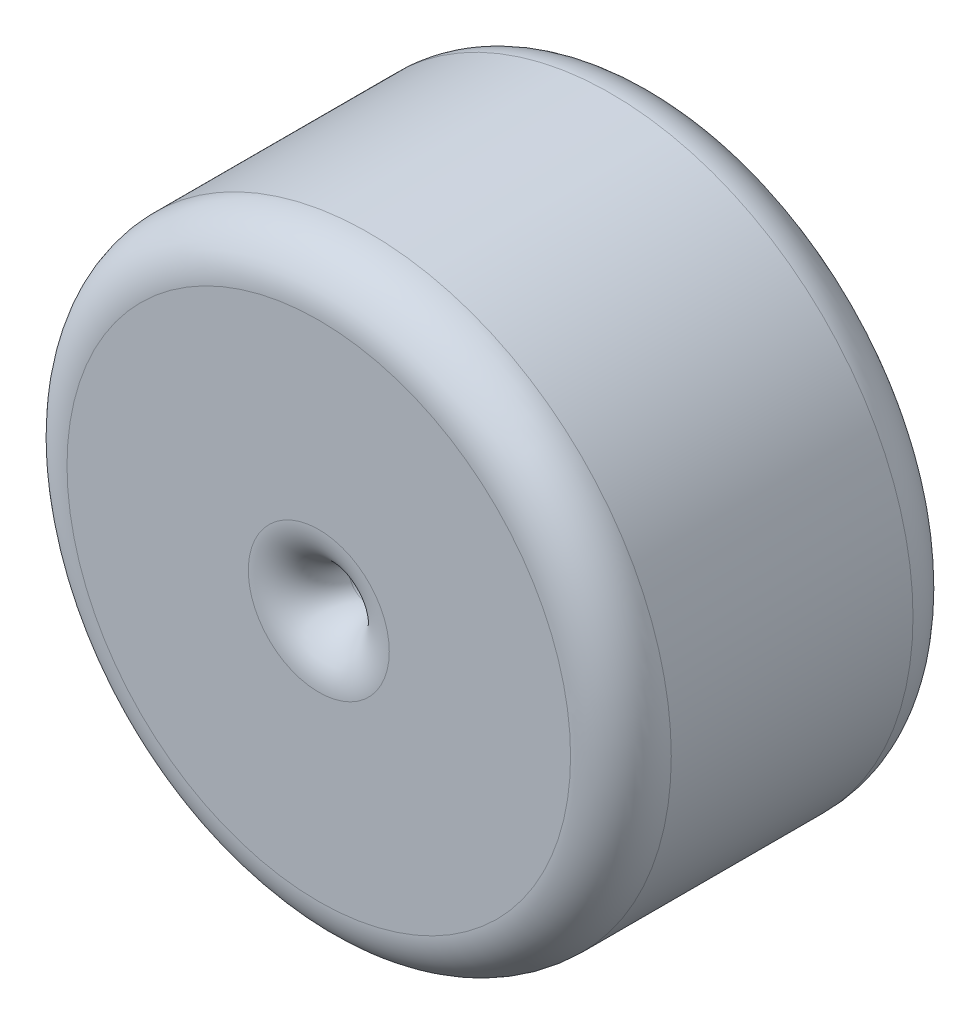
ISO-10303-21;
HEADER;
FILE_DESCRIPTION(('STEP AP214'),'2;1');
FILE_NAME('part.step','',(''),(''),'','','');
FILE_SCHEMA(('AUTOMOTIVE_DESIGN { 1 0 10303 214 1 1 1 1 }'));
ENDSEC;
DATA;
#1=APPLICATION_CONTEXT('core data for automotive mechanical design processes');
#2=APPLICATION_PROTOCOL_DEFINITION('international standard','automotive_design',2000,#1);
#3=PRODUCT_CONTEXT('',#1,'mechanical');
#4=PRODUCT('Part','Part','',(#3));
#5=PRODUCT_RELATED_PRODUCT_CATEGORY('part','',(#4));
#6=PRODUCT_DEFINITION_FORMATION('','',#4);
#7=PRODUCT_DEFINITION_CONTEXT('part definition',#1,'design');
#8=PRODUCT_DEFINITION('design','',#6,#7);
#9=PRODUCT_DEFINITION_SHAPE('','',#8);
#10=(LENGTH_UNIT() NAMED_UNIT(*) SI_UNIT(.MILLI.,.METRE.));
#11=(NAMED_UNIT(*) PLANE_ANGLE_UNIT() SI_UNIT($,.RADIAN.));
#12=(NAMED_UNIT(*) SI_UNIT($,.STERADIAN.) SOLID_ANGLE_UNIT());
#13=UNCERTAINTY_MEASURE_WITH_UNIT(LENGTH_MEASURE(1.E-05),#10,'distance_accuracy_value','');
#14=(GEOMETRIC_REPRESENTATION_CONTEXT(3) GLOBAL_UNCERTAINTY_ASSIGNED_CONTEXT((#13)) GLOBAL_UNIT_ASSIGNED_CONTEXT((#10,
#11,#12)) REPRESENTATION_CONTEXT('',''));
#15=CARTESIAN_POINT('',(0.,0.,0.));
#16=DIRECTION('',(0.,0.,1.));
#17=DIRECTION('',(1.,0.,0.));
#18=AXIS2_PLACEMENT_3D('',#15,#16,#17);
#19=CARTESIAN_POINT('',(0.,0.,17.));
#20=DIRECTION('',(0.,0.,-1.));
#21=DIRECTION('',(-1.,0.,0.));
#22=AXIS2_PLACEMENT_3D('',#19,#20,#21);
#23=CYLINDRICAL_SURFACE('',#22,15.);
#24=CARTESIAN_POINT('',(0.,0.,2.5));
#25=DIRECTION('',(0.,0.,1.));
#26=DIRECTION('',(1.,0.,0.));
#27=AXIS2_PLACEMENT_3D('',#24,#25,#26);
#28=CIRCLE('',#27,15.);
#29=CARTESIAN_POINT('',(15.,0.,2.5));
#30=VERTEX_POINT('',#29);
#31=EDGE_CURVE('E46',#30,#30,#28,.T.);
#32=ORIENTED_EDGE('',*,*,#31,.T.);
#33=EDGE_LOOP('',(#32));
#34=FACE_BOUND('',#33,.T.);
#35=CARTESIAN_POINT('',(0.,0.,14.5));
#36=DIRECTION('',(0.,0.,1.));
#37=DIRECTION('',(1.,0.,0.));
#38=AXIS2_PLACEMENT_3D('',#35,#36,#37);
#39=CIRCLE('',#38,15.);
#40=CARTESIAN_POINT('',(15.,0.,14.5));
#41=VERTEX_POINT('',#40);
#42=EDGE_CURVE('E50',#41,#41,#39,.F.);
#43=ORIENTED_EDGE('',*,*,#42,.T.);
#44=EDGE_LOOP('',(#43));
#45=FACE_BOUND('',#44,.T.);
#46=ADVANCED_FACE('F39',(#34,#45),#23,.T.);
#47=CARTESIAN_POINT('',(0.,0.,17.));
#48=DIRECTION('',(0.,0.,1.));
#49=DIRECTION('',(1.,0.,0.));
#50=AXIS2_PLACEMENT_3D('',#47,#48,#49);
#51=PLANE('',#50);
#52=CARTESIAN_POINT('',(0.,0.,17.));
#53=DIRECTION('',(0.,0.,1.));
#54=DIRECTION('',(1.,0.,0.));
#55=AXIS2_PLACEMENT_3D('',#52,#53,#54);
#56=CIRCLE('',#55,3.5);
#57=CARTESIAN_POINT('',(3.5,0.,17.));
#58=VERTEX_POINT('',#57);
#59=EDGE_CURVE('E59',#58,#58,#56,.F.);
#60=ORIENTED_EDGE('',*,*,#59,.T.);
#61=EDGE_LOOP('',(#60));
#62=FACE_BOUND('',#61,.T.);
#63=CARTESIAN_POINT('',(0.,0.,17.));
#64=DIRECTION('',(0.,0.,1.));
#65=DIRECTION('',(1.,0.,0.));
#66=AXIS2_PLACEMENT_3D('',#63,#64,#65);
#67=CIRCLE('',#66,12.5);
#68=CARTESIAN_POINT('',(12.5,0.,17.));
#69=VERTEX_POINT('',#68);
#70=EDGE_CURVE('E62',#69,#69,#67,.T.);
#71=ORIENTED_EDGE('',*,*,#70,.T.);
#72=EDGE_LOOP('',(#71));
#73=FACE_BOUND('',#72,.T.);
#74=ADVANCED_FACE('F73',(#62,#73),#51,.T.);
#75=CARTESIAN_POINT('',(0.,0.,0.));
#76=DIRECTION('',(0.,0.,1.));
#77=DIRECTION('',(1.,0.,0.));
#78=AXIS2_PLACEMENT_3D('',#75,#76,#77);
#79=PLANE('',#78);
#80=CARTESIAN_POINT('',(0.,0.,0.));
#81=DIRECTION('',(0.,0.,1.));
#82=DIRECTION('',(1.,0.,0.));
#83=AXIS2_PLACEMENT_3D('',#80,#81,#82);
#84=CIRCLE('',#83,12.5);
#85=CARTESIAN_POINT('',(12.5,0.,0.));
#86=VERTEX_POINT('',#85);
#87=EDGE_CURVE('E10',#86,#86,#84,.F.);
#88=ORIENTED_EDGE('',*,*,#87,.T.);
#89=EDGE_LOOP('',(#88));
#90=FACE_BOUND('',#89,.T.);
#91=CARTESIAN_POINT('',(0.,0.,0.));
#92=DIRECTION('',(0.,0.,-1.));
#93=DIRECTION('',(-1.,0.,0.));
#94=AXIS2_PLACEMENT_3D('',#91,#92,#93);
#95=CIRCLE('',#94,1.);
#96=CARTESIAN_POINT('',(-1.,0.,0.));
#97=VERTEX_POINT('',#96);
#98=EDGE_CURVE('E65',#97,#97,#95,.T.);
#99=ORIENTED_EDGE('',*,*,#98,.F.);
#100=EDGE_LOOP('',(#99));
#101=FACE_BOUND('',#100,.T.);
#102=ADVANCED_FACE('F71',(#90,#101),#79,.F.);
#103=CARTESIAN_POINT('',(0.,0.,17.));
#104=DIRECTION('',(0.,0.,-1.));
#105=DIRECTION('',(-1.,0.,0.));
#106=AXIS2_PLACEMENT_3D('',#103,#104,#105);
#107=CYLINDRICAL_SURFACE('',#106,1.);
#108=CARTESIAN_POINT('',(0.,0.,14.5));
#109=DIRECTION('',(0.,0.,1.));
#110=DIRECTION('',(1.,0.,0.));
#111=AXIS2_PLACEMENT_3D('',#108,#109,#110);
#112=CIRCLE('',#111,1.);
#113=CARTESIAN_POINT('',(1.,0.,14.5));
#114=VERTEX_POINT('',#113);
#115=EDGE_CURVE('E54',#114,#114,#112,.T.);
#116=ORIENTED_EDGE('',*,*,#115,.T.);
#117=EDGE_LOOP('',(#116));
#118=FACE_BOUND('',#117,.T.);
#119=ORIENTED_EDGE('',*,*,#98,.T.);
#120=EDGE_LOOP('',(#119));
#121=FACE_BOUND('',#120,.T.);
#122=ADVANCED_FACE('F69',(#118,#121),#107,.F.);
#123=CARTESIAN_POINT('',(0.,0.,14.5));
#124=DIRECTION('',(0.,0.,1.));
#125=DIRECTION('',(1.,0.,0.));
#126=AXIS2_PLACEMENT_3D('',#123,#124,#125);
#127=TOROIDAL_SURFACE('',#126,3.5,2.5);
#128=ORIENTED_EDGE('',*,*,#115,.F.);
#129=EDGE_LOOP('',(#128));
#130=FACE_BOUND('',#129,.T.);
#131=ORIENTED_EDGE('',*,*,#59,.F.);
#132=EDGE_LOOP('',(#131));
#133=FACE_BOUND('',#132,.T.);
#134=ADVANCED_FACE('F79',(#130,#133),#127,.T.);
#135=CARTESIAN_POINT('',(0.,0.,2.5));
#136=DIRECTION('',(0.,0.,1.));
#137=DIRECTION('',(1.,0.,0.));
#138=AXIS2_PLACEMENT_3D('',#135,#136,#137);
#139=TOROIDAL_SURFACE('',#138,12.5,2.5);
#140=ORIENTED_EDGE('',*,*,#87,.F.);
#141=EDGE_LOOP('',(#140));
#142=FACE_BOUND('',#141,.T.);
#143=ORIENTED_EDGE('',*,*,#31,.F.);
#144=EDGE_LOOP('',(#143));
#145=FACE_BOUND('',#144,.T.);
#146=ADVANCED_FACE('F91',(#142,#145),#139,.T.);
#147=CARTESIAN_POINT('',(0.,0.,14.5));
#148=DIRECTION('',(0.,0.,1.));
#149=DIRECTION('',(1.,0.,0.));
#150=AXIS2_PLACEMENT_3D('',#147,#148,#149);
#151=TOROIDAL_SURFACE('',#150,12.5,2.5);
#152=ORIENTED_EDGE('',*,*,#42,.F.);
#153=EDGE_LOOP('',(#152));
#154=FACE_BOUND('',#153,.T.);
#155=ORIENTED_EDGE('',*,*,#70,.F.);
#156=EDGE_LOOP('',(#155));
#157=FACE_BOUND('',#156,.T.);
#158=ADVANCED_FACE('F41',(#154,#157),#151,.T.);
#159=CLOSED_SHELL('',(#46,#74,#102,#122,#134,#146,#158));
#160=MANIFOLD_SOLID_BREP('B2',#159);
#161=ADVANCED_BREP_SHAPE_REPRESENTATION('',(#18,#160),#14);
#162=SHAPE_DEFINITION_REPRESENTATION(#9,#161);
ENDSEC;
END-ISO-10303-21;
